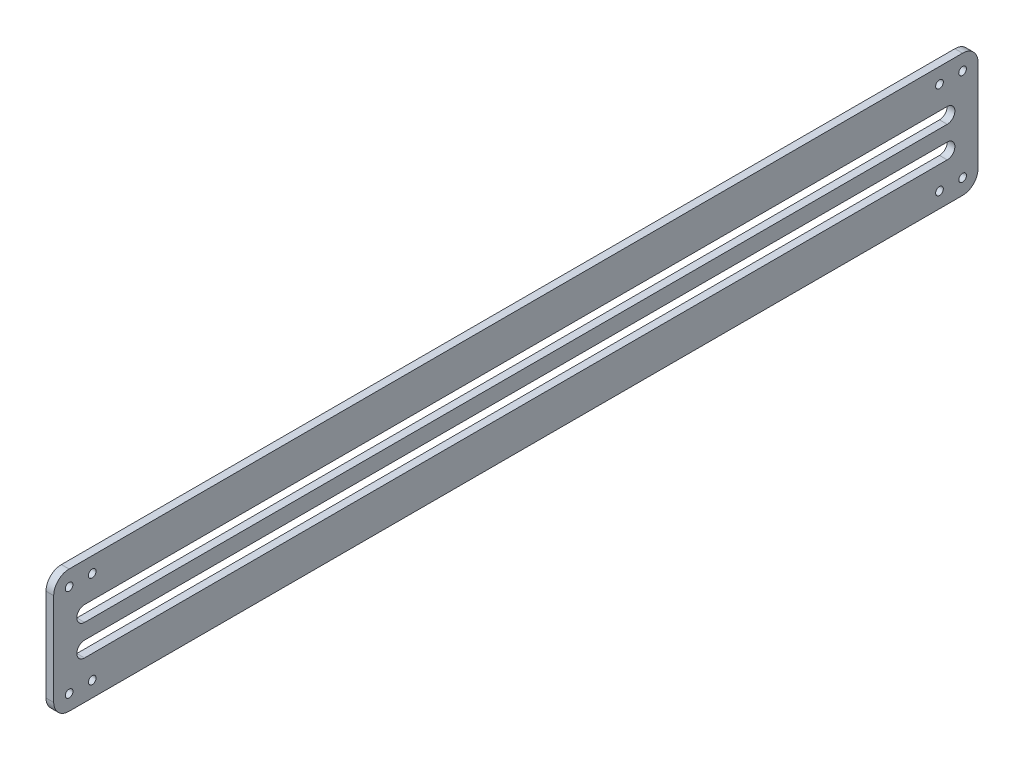
ISO-10303-21;
HEADER;
FILE_DESCRIPTION(('STEP AP214'),'2;1');
FILE_NAME('part.step','',(''),(''),'','','');
FILE_SCHEMA(('AUTOMOTIVE_DESIGN { 1 0 10303 214 1 1 1 1 }'));
ENDSEC;
DATA;
#1=APPLICATION_CONTEXT('core data for automotive mechanical design processes');
#2=APPLICATION_PROTOCOL_DEFINITION('international standard','automotive_design',2000,#1);
#3=PRODUCT_CONTEXT('',#1,'mechanical');
#4=PRODUCT('Part','Part','',(#3));
#5=PRODUCT_RELATED_PRODUCT_CATEGORY('part','',(#4));
#6=PRODUCT_DEFINITION_FORMATION('','',#4);
#7=PRODUCT_DEFINITION_CONTEXT('part definition',#1,'design');
#8=PRODUCT_DEFINITION('design','',#6,#7);
#9=PRODUCT_DEFINITION_SHAPE('','',#8);
#10=(LENGTH_UNIT() NAMED_UNIT(*) SI_UNIT(.MILLI.,.METRE.));
#11=(NAMED_UNIT(*) PLANE_ANGLE_UNIT() SI_UNIT($,.RADIAN.));
#12=(NAMED_UNIT(*) SI_UNIT($,.STERADIAN.) SOLID_ANGLE_UNIT());
#13=UNCERTAINTY_MEASURE_WITH_UNIT(LENGTH_MEASURE(1.E-05),#10,'distance_accuracy_value','');
#14=(GEOMETRIC_REPRESENTATION_CONTEXT(3) GLOBAL_UNCERTAINTY_ASSIGNED_CONTEXT((#13)) GLOBAL_UNIT_ASSIGNED_CONTEXT((#10,
#11,#12)) REPRESENTATION_CONTEXT('',''));
#15=CARTESIAN_POINT('',(0.,0.,0.));
#16=DIRECTION('',(0.,0.,1.));
#17=DIRECTION('',(1.,0.,0.));
#18=AXIS2_PLACEMENT_3D('',#15,#16,#17);
#19=CARTESIAN_POINT('',(1.5875,19.05,-184.15));
#20=DIRECTION('',(-1.,0.,0.));
#21=DIRECTION('',(0.,0.,1.));
#22=AXIS2_PLACEMENT_3D('',#19,#20,#21);
#23=CYLINDRICAL_SURFACE('',#22,6.35);
#24=CARTESIAN_POINT('',(-1.5875,19.05,-184.15));
#25=DIRECTION('',(1.,0.,0.));
#26=DIRECTION('',(0.,0.,1.));
#27=AXIS2_PLACEMENT_3D('',#24,#25,#26);
#28=CIRCLE('',#27,6.35);
#29=CARTESIAN_POINT('',(-1.5875,19.05,-190.5));
#30=VERTEX_POINT('',#29);
#31=CARTESIAN_POINT('',(-1.5875,25.4,-184.15));
#32=VERTEX_POINT('',#31);
#33=EDGE_CURVE('E207',#30,#32,#28,.T.);
#34=ORIENTED_EDGE('',*,*,#33,.T.);
#35=DIRECTION('',(-1.,0.,0.));
#36=VECTOR('',#35,1.);
#37=CARTESIAN_POINT('',(1.5875,25.4,-184.15));
#38=LINE('',#37,#36);
#39=CARTESIAN_POINT('',(1.5875,25.4,-184.15));
#40=VERTEX_POINT('',#39);
#41=EDGE_CURVE('E11',#40,#32,#38,.T.);
#42=ORIENTED_EDGE('',*,*,#41,.F.);
#43=CARTESIAN_POINT('',(1.5875,19.05,-184.15));
#44=DIRECTION('',(1.,0.,0.));
#45=DIRECTION('',(0.,0.,1.));
#46=AXIS2_PLACEMENT_3D('',#43,#44,#45);
#47=CIRCLE('',#46,6.35);
#48=CARTESIAN_POINT('',(1.5875,19.05,-190.5));
#49=VERTEX_POINT('',#48);
#50=EDGE_CURVE('E256',#49,#40,#47,.T.);
#51=ORIENTED_EDGE('',*,*,#50,.F.);
#52=DIRECTION('',(-1.,0.,0.));
#53=VECTOR('',#52,1.);
#54=CARTESIAN_POINT('',(1.5875,19.05,-190.5));
#55=LINE('',#54,#53);
#56=EDGE_CURVE('E282',#49,#30,#55,.T.);
#57=ORIENTED_EDGE('',*,*,#56,.T.);
#58=EDGE_LOOP('',(#34,#42,#51,#57));
#59=FACE_BOUND('',#58,.T.);
#60=ADVANCED_FACE('F45',(#59),#23,.T.);
#61=CARTESIAN_POINT('',(1.5875,25.4,184.15));
#62=DIRECTION('',(0.,-1.,0.));
#63=DIRECTION('',(0.,0.,-1.));
#64=AXIS2_PLACEMENT_3D('',#61,#62,#63);
#65=PLANE('',#64);
#66=DIRECTION('',(0.,0.,1.));
#67=VECTOR('',#66,1.);
#68=CARTESIAN_POINT('',(-1.5875,25.4,184.15));
#69=LINE('',#68,#67);
#70=CARTESIAN_POINT('',(-1.5875,25.4,184.15));
#71=VERTEX_POINT('',#70);
#72=EDGE_CURVE('E286',#32,#71,#69,.T.);
#73=ORIENTED_EDGE('',*,*,#72,.T.);
#74=DIRECTION('',(-1.,0.,0.));
#75=VECTOR('',#74,1.);
#76=CARTESIAN_POINT('',(1.5875,25.4,184.15));
#77=LINE('',#76,#75);
#78=CARTESIAN_POINT('',(1.5875,25.4,184.15));
#79=VERTEX_POINT('',#78);
#80=EDGE_CURVE('E53',#79,#71,#77,.T.);
#81=ORIENTED_EDGE('',*,*,#80,.F.);
#82=DIRECTION('',(0.,0.,1.));
#83=VECTOR('',#82,1.);
#84=CARTESIAN_POINT('',(1.5875,25.4,184.15));
#85=LINE('',#84,#83);
#86=EDGE_CURVE('E260',#40,#79,#85,.T.);
#87=ORIENTED_EDGE('',*,*,#86,.F.);
#88=ORIENTED_EDGE('',*,*,#41,.T.);
#89=EDGE_LOOP('',(#73,#81,#87,#88));
#90=FACE_BOUND('',#89,.T.);
#91=ADVANCED_FACE('F356',(#90),#65,.F.);
#92=CARTESIAN_POINT('',(1.5875,19.05,184.15));
#93=DIRECTION('',(-1.,0.,0.));
#94=DIRECTION('',(0.,0.,1.));
#95=AXIS2_PLACEMENT_3D('',#92,#93,#94);
#96=CYLINDRICAL_SURFACE('',#95,6.35);
#97=CARTESIAN_POINT('',(-1.5875,19.05,184.15));
#98=DIRECTION('',(1.,0.,0.));
#99=DIRECTION('',(0.,0.,1.));
#100=AXIS2_PLACEMENT_3D('',#97,#98,#99);
#101=CIRCLE('',#100,6.35);
#102=CARTESIAN_POINT('',(-1.5875,19.05,190.5));
#103=VERTEX_POINT('',#102);
#104=EDGE_CURVE('E289',#71,#103,#101,.T.);
#105=ORIENTED_EDGE('',*,*,#104,.T.);
#106=DIRECTION('',(-1.,0.,0.));
#107=VECTOR('',#106,1.);
#108=CARTESIAN_POINT('',(1.5875,19.05,190.5));
#109=LINE('',#108,#107);
#110=CARTESIAN_POINT('',(1.5875,19.05,190.5));
#111=VERTEX_POINT('',#110);
#112=EDGE_CURVE('E325',#111,#103,#109,.T.);
#113=ORIENTED_EDGE('',*,*,#112,.F.);
#114=CARTESIAN_POINT('',(1.5875,19.05,184.15));
#115=DIRECTION('',(1.,0.,0.));
#116=DIRECTION('',(0.,0.,1.));
#117=AXIS2_PLACEMENT_3D('',#114,#115,#116);
#118=CIRCLE('',#117,6.35);
#119=EDGE_CURVE('E264',#79,#111,#118,.T.);
#120=ORIENTED_EDGE('',*,*,#119,.F.);
#121=ORIENTED_EDGE('',*,*,#80,.T.);
#122=EDGE_LOOP('',(#105,#113,#120,#121));
#123=FACE_BOUND('',#122,.T.);
#124=ADVANCED_FACE('F334',(#123),#96,.T.);
#125=CARTESIAN_POINT('',(1.5875,-19.05,190.5));
#126=DIRECTION('',(0.,0.,-1.));
#127=DIRECTION('',(-1.,0.,0.));
#128=AXIS2_PLACEMENT_3D('',#125,#126,#127);
#129=PLANE('',#128);
#130=DIRECTION('',(0.,-1.,0.));
#131=VECTOR('',#130,1.);
#132=CARTESIAN_POINT('',(-1.5875,-19.05,190.5));
#133=LINE('',#132,#131);
#134=CARTESIAN_POINT('',(-1.5875,-19.05,190.5));
#135=VERTEX_POINT('',#134);
#136=EDGE_CURVE('E292',#103,#135,#133,.T.);
#137=ORIENTED_EDGE('',*,*,#136,.T.);
#138=DIRECTION('',(-1.,0.,0.));
#139=VECTOR('',#138,1.);
#140=CARTESIAN_POINT('',(1.5875,-19.05,190.5));
#141=LINE('',#140,#139);
#142=CARTESIAN_POINT('',(1.5875,-19.05,190.5));
#143=VERTEX_POINT('',#142);
#144=EDGE_CURVE('E321',#143,#135,#141,.T.);
#145=ORIENTED_EDGE('',*,*,#144,.F.);
#146=DIRECTION('',(0.,-1.,0.));
#147=VECTOR('',#146,1.);
#148=CARTESIAN_POINT('',(1.5875,-19.05,190.5));
#149=LINE('',#148,#147);
#150=EDGE_CURVE('E267',#111,#143,#149,.T.);
#151=ORIENTED_EDGE('',*,*,#150,.F.);
#152=ORIENTED_EDGE('',*,*,#112,.T.);
#153=EDGE_LOOP('',(#137,#145,#151,#152));
#154=FACE_BOUND('',#153,.T.);
#155=ADVANCED_FACE('F344',(#154),#129,.F.);
#156=CARTESIAN_POINT('',(1.5875,-19.05,184.15));
#157=DIRECTION('',(-1.,0.,0.));
#158=DIRECTION('',(0.,0.,1.));
#159=AXIS2_PLACEMENT_3D('',#156,#157,#158);
#160=CYLINDRICAL_SURFACE('',#159,6.35);
#161=CARTESIAN_POINT('',(-1.5875,-19.05,184.15));
#162=DIRECTION('',(1.,0.,0.));
#163=DIRECTION('',(0.,0.,1.));
#164=AXIS2_PLACEMENT_3D('',#161,#162,#163);
#165=CIRCLE('',#164,6.35);
#166=CARTESIAN_POINT('',(-1.5875,-25.4,184.15));
#167=VERTEX_POINT('',#166);
#168=EDGE_CURVE('E295',#135,#167,#165,.T.);
#169=ORIENTED_EDGE('',*,*,#168,.T.);
#170=DIRECTION('',(-1.,0.,0.));
#171=VECTOR('',#170,1.);
#172=CARTESIAN_POINT('',(1.5875,-25.4,184.15));
#173=LINE('',#172,#171);
#174=CARTESIAN_POINT('',(1.5875,-25.4,184.15));
#175=VERTEX_POINT('',#174);
#176=EDGE_CURVE('E317',#175,#167,#173,.T.);
#177=ORIENTED_EDGE('',*,*,#176,.F.);
#178=CARTESIAN_POINT('',(1.5875,-19.05,184.15));
#179=DIRECTION('',(1.,0.,0.));
#180=DIRECTION('',(0.,0.,1.));
#181=AXIS2_PLACEMENT_3D('',#178,#179,#180);
#182=CIRCLE('',#181,6.35);
#183=EDGE_CURVE('E270',#143,#175,#182,.T.);
#184=ORIENTED_EDGE('',*,*,#183,.F.);
#185=ORIENTED_EDGE('',*,*,#144,.T.);
#186=EDGE_LOOP('',(#169,#177,#184,#185));
#187=FACE_BOUND('',#186,.T.);
#188=ADVANCED_FACE('F348',(#187),#160,.T.);
#189=CARTESIAN_POINT('',(1.5875,-25.4,184.15));
#190=DIRECTION('',(0.,1.,0.));
#191=DIRECTION('',(0.,0.,1.));
#192=AXIS2_PLACEMENT_3D('',#189,#190,#191);
#193=PLANE('',#192);
#194=DIRECTION('',(0.,0.,-1.));
#195=VECTOR('',#194,1.);
#196=CARTESIAN_POINT('',(-1.5875,-25.4,184.15));
#197=LINE('',#196,#195);
#198=CARTESIAN_POINT('',(-1.5875,-25.4,-184.15));
#199=VERTEX_POINT('',#198);
#200=EDGE_CURVE('E298',#167,#199,#197,.T.);
#201=ORIENTED_EDGE('',*,*,#200,.T.);
#202=DIRECTION('',(-1.,0.,0.));
#203=VECTOR('',#202,1.);
#204=CARTESIAN_POINT('',(1.5875,-25.4,-184.15));
#205=LINE('',#204,#203);
#206=CARTESIAN_POINT('',(1.5875,-25.4,-184.15));
#207=VERTEX_POINT('',#206);
#208=EDGE_CURVE('E313',#207,#199,#205,.T.);
#209=ORIENTED_EDGE('',*,*,#208,.F.);
#210=DIRECTION('',(0.,0.,-1.));
#211=VECTOR('',#210,1.);
#212=CARTESIAN_POINT('',(1.5875,-25.4,184.15));
#213=LINE('',#212,#211);
#214=EDGE_CURVE('E273',#175,#207,#213,.T.);
#215=ORIENTED_EDGE('',*,*,#214,.F.);
#216=ORIENTED_EDGE('',*,*,#176,.T.);
#217=EDGE_LOOP('',(#201,#209,#215,#216));
#218=FACE_BOUND('',#217,.T.);
#219=ADVANCED_FACE('F369',(#218),#193,.F.);
#220=CARTESIAN_POINT('',(1.5875,-19.05,-184.15));
#221=DIRECTION('',(-1.,0.,0.));
#222=DIRECTION('',(0.,0.,1.));
#223=AXIS2_PLACEMENT_3D('',#220,#221,#222);
#224=CYLINDRICAL_SURFACE('',#223,6.35);
#225=CARTESIAN_POINT('',(-1.5875,-19.05,-184.15));
#226=DIRECTION('',(1.,0.,0.));
#227=DIRECTION('',(0.,0.,1.));
#228=AXIS2_PLACEMENT_3D('',#225,#226,#227);
#229=CIRCLE('',#228,6.35);
#230=CARTESIAN_POINT('',(-1.5875,-19.05,-190.5));
#231=VERTEX_POINT('',#230);
#232=EDGE_CURVE('E301',#199,#231,#229,.T.);
#233=ORIENTED_EDGE('',*,*,#232,.T.);
#234=DIRECTION('',(-1.,0.,0.));
#235=VECTOR('',#234,1.);
#236=CARTESIAN_POINT('',(1.5875,-19.05,-190.5));
#237=LINE('',#236,#235);
#238=CARTESIAN_POINT('',(1.5875,-19.05,-190.5));
#239=VERTEX_POINT('',#238);
#240=EDGE_CURVE('E309',#239,#231,#237,.T.);
#241=ORIENTED_EDGE('',*,*,#240,.F.);
#242=CARTESIAN_POINT('',(1.5875,-19.05,-184.15));
#243=DIRECTION('',(1.,0.,0.));
#244=DIRECTION('',(0.,0.,1.));
#245=AXIS2_PLACEMENT_3D('',#242,#243,#244);
#246=CIRCLE('',#245,6.35);
#247=EDGE_CURVE('E276',#207,#239,#246,.T.);
#248=ORIENTED_EDGE('',*,*,#247,.F.);
#249=ORIENTED_EDGE('',*,*,#208,.T.);
#250=EDGE_LOOP('',(#233,#241,#248,#249));
#251=FACE_BOUND('',#250,.T.);
#252=ADVANCED_FACE('F367',(#251),#224,.T.);
#253=CARTESIAN_POINT('',(1.5875,-19.05,-190.5));
#254=DIRECTION('',(0.,0.,1.));
#255=DIRECTION('',(1.,0.,0.));
#256=AXIS2_PLACEMENT_3D('',#253,#254,#255);
#257=PLANE('',#256);
#258=DIRECTION('',(0.,1.,0.));
#259=VECTOR('',#258,1.);
#260=CARTESIAN_POINT('',(-1.5875,-19.05,-190.5));
#261=LINE('',#260,#259);
#262=EDGE_CURVE('E261',#231,#30,#261,.T.);
#263=ORIENTED_EDGE('',*,*,#262,.T.);
#264=ORIENTED_EDGE('',*,*,#56,.F.);
#265=DIRECTION('',(0.,1.,0.));
#266=VECTOR('',#265,1.);
#267=CARTESIAN_POINT('',(1.5875,-19.05,-190.5));
#268=LINE('',#267,#266);
#269=EDGE_CURVE('E279',#239,#49,#268,.T.);
#270=ORIENTED_EDGE('',*,*,#269,.F.);
#271=ORIENTED_EDGE('',*,*,#240,.T.);
#272=EDGE_LOOP('',(#263,#264,#270,#271));
#273=FACE_BOUND('',#272,.T.);
#274=ADVANCED_FACE('F362',(#273),#257,.F.);
#275=CARTESIAN_POINT('',(1.5875,19.05,-184.15));
#276=DIRECTION('',(-1.,0.,0.));
#277=DIRECTION('',(0.,0.,1.));
#278=AXIS2_PLACEMENT_3D('',#275,#276,#277);
#279=PLANE('',#278);
#280=CARTESIAN_POINT('',(1.5875,19.05,-174.625));
#281=DIRECTION('',(1.,0.,0.));
#282=DIRECTION('',(0.,0.,1.));
#283=AXIS2_PLACEMENT_3D('',#280,#281,#282);
#284=CIRCLE('',#283,1.58749999999999);
#285=CARTESIAN_POINT('',(1.5875,19.05,-173.0375));
#286=VERTEX_POINT('',#285);
#287=EDGE_CURVE('E598',#286,#286,#284,.T.);
#288=ORIENTED_EDGE('',*,*,#287,.F.);
#289=EDGE_LOOP('',(#288));
#290=FACE_BOUND('',#289,.T.);
#291=CARTESIAN_POINT('',(1.5875,-19.0500000000001,184.15));
#292=DIRECTION('',(1.,0.,0.));
#293=DIRECTION('',(0.,0.,1.));
#294=AXIS2_PLACEMENT_3D('',#291,#292,#293);
#295=CIRCLE('',#294,1.58749999999999);
#296=CARTESIAN_POINT('',(1.5875,-19.0500000000001,185.7375));
#297=VERTEX_POINT('',#296);
#298=EDGE_CURVE('E605',#297,#297,#295,.T.);
#299=ORIENTED_EDGE('',*,*,#298,.F.);
#300=EDGE_LOOP('',(#299));
#301=FACE_BOUND('',#300,.T.);
#302=CARTESIAN_POINT('',(1.5875,-19.05,174.625));
#303=DIRECTION('',(1.,0.,0.));
#304=DIRECTION('',(0.,0.,1.));
#305=AXIS2_PLACEMENT_3D('',#302,#303,#304);
#306=CIRCLE('',#305,1.58749999999999);
#307=CARTESIAN_POINT('',(1.5875,-19.05,176.2125));
#308=VERTEX_POINT('',#307);
#309=EDGE_CURVE('E619',#308,#308,#306,.T.);
#310=ORIENTED_EDGE('',*,*,#309,.F.);
#311=EDGE_LOOP('',(#310));
#312=FACE_BOUND('',#311,.T.);
#313=CARTESIAN_POINT('',(1.5875,19.05,174.625));
#314=DIRECTION('',(1.,0.,0.));
#315=DIRECTION('',(0.,0.,-1.));
#316=AXIS2_PLACEMENT_3D('',#313,#314,#315);
#317=CIRCLE('',#316,1.58749999999999);
#318=CARTESIAN_POINT('',(1.5875,19.05,173.0375));
#319=VERTEX_POINT('',#318);
#320=EDGE_CURVE('E611',#319,#319,#317,.T.);
#321=ORIENTED_EDGE('',*,*,#320,.F.);
#322=EDGE_LOOP('',(#321));
#323=FACE_BOUND('',#322,.T.);
#324=CARTESIAN_POINT('',(1.5875,19.05,-184.15));
#325=DIRECTION('',(1.,0.,0.));
#326=DIRECTION('',(0.,0.,1.));
#327=AXIS2_PLACEMENT_3D('',#324,#325,#326);
#328=CIRCLE('',#327,1.58749999999999);
#329=CARTESIAN_POINT('',(1.5875,19.05,-182.5625));
#330=VERTEX_POINT('',#329);
#331=EDGE_CURVE('E607',#330,#330,#328,.T.);
#332=ORIENTED_EDGE('',*,*,#331,.F.);
#333=EDGE_LOOP('',(#332));
#334=FACE_BOUND('',#333,.T.);
#335=CARTESIAN_POINT('',(1.5875,-19.0500000000001,-184.15));
#336=DIRECTION('',(1.,0.,0.));
#337=DIRECTION('',(0.,0.,-1.));
#338=AXIS2_PLACEMENT_3D('',#335,#336,#337);
#339=CIRCLE('',#338,1.58749999999999);
#340=CARTESIAN_POINT('',(1.5875,-19.0500000000001,-185.7375));
#341=VERTEX_POINT('',#340);
#342=EDGE_CURVE('E663',#341,#341,#339,.T.);
#343=ORIENTED_EDGE('',*,*,#342,.F.);
#344=EDGE_LOOP('',(#343));
#345=FACE_BOUND('',#344,.T.);
#346=CARTESIAN_POINT('',(1.5875,-19.05,-174.625));
#347=DIRECTION('',(1.,0.,0.));
#348=DIRECTION('',(0.,0.,-1.));
#349=AXIS2_PLACEMENT_3D('',#346,#347,#348);
#350=CIRCLE('',#349,1.58749999999999);
#351=CARTESIAN_POINT('',(1.5875,-19.05,-176.2125));
#352=VERTEX_POINT('',#351);
#353=EDGE_CURVE('E655',#352,#352,#350,.T.);
#354=ORIENTED_EDGE('',*,*,#353,.F.);
#355=EDGE_LOOP('',(#354));
#356=FACE_BOUND('',#355,.T.);
#357=CARTESIAN_POINT('',(1.5875,19.05,184.15));
#358=DIRECTION('',(1.,0.,0.));
#359=DIRECTION('',(0.,0.,-1.));
#360=AXIS2_PLACEMENT_3D('',#357,#358,#359);
#361=CIRCLE('',#360,1.58749999999999);
#362=CARTESIAN_POINT('',(1.5875,19.05,182.5625));
#363=VERTEX_POINT('',#362);
#364=EDGE_CURVE('E189',#363,#363,#361,.T.);
#365=ORIENTED_EDGE('',*,*,#364,.F.);
#366=EDGE_LOOP('',(#365));
#367=FACE_BOUND('',#366,.T.);
#368=DIRECTION('',(0.,0.,-1.));
#369=VECTOR('',#368,1.);
#370=CARTESIAN_POINT('',(1.5875,3.175,177.8));
#371=LINE('',#370,#369);
#372=CARTESIAN_POINT('',(1.5875,3.175,177.8));
#373=VERTEX_POINT('',#372);
#374=CARTESIAN_POINT('',(1.5875,3.175,-177.8));
#375=VERTEX_POINT('',#374);
#376=EDGE_CURVE('E198',#373,#375,#371,.T.);
#377=ORIENTED_EDGE('',*,*,#376,.F.);
#378=CARTESIAN_POINT('',(1.5875,6.35000000000001,177.8));
#379=DIRECTION('',(1.,0.,0.));
#380=DIRECTION('',(0.,0.,-1.));
#381=AXIS2_PLACEMENT_3D('',#378,#379,#380);
#382=CIRCLE('',#381,3.17500000000001);
#383=CARTESIAN_POINT('',(1.5875,9.52500000000002,177.8));
#384=VERTEX_POINT('',#383);
#385=EDGE_CURVE('E60',#384,#373,#382,.T.);
#386=ORIENTED_EDGE('',*,*,#385,.F.);
#387=DIRECTION('',(0.,0.,1.));
#388=VECTOR('',#387,1.);
#389=CARTESIAN_POINT('',(1.5875,9.52500000000002,177.8));
#390=LINE('',#389,#388);
#391=CARTESIAN_POINT('',(1.5875,9.52500000000002,-177.8));
#392=VERTEX_POINT('',#391);
#393=EDGE_CURVE('E182',#392,#384,#390,.T.);
#394=ORIENTED_EDGE('',*,*,#393,.F.);
#395=CARTESIAN_POINT('',(1.5875,6.35000000000001,-177.8));
#396=DIRECTION('',(1.,0.,0.));
#397=DIRECTION('',(0.,0.,-1.));
#398=AXIS2_PLACEMENT_3D('',#395,#396,#397);
#399=CIRCLE('',#398,3.17500000000001);
#400=EDGE_CURVE('E186',#375,#392,#399,.T.);
#401=ORIENTED_EDGE('',*,*,#400,.F.);
#402=EDGE_LOOP('',(#377,#386,#394,#401));
#403=FACE_BOUND('',#402,.T.);
#404=DIRECTION('',(0.,0.,-1.));
#405=VECTOR('',#404,1.);
#406=CARTESIAN_POINT('',(1.5875,-9.52500000000002,177.8));
#407=LINE('',#406,#405);
#408=CARTESIAN_POINT('',(1.5875,-9.52500000000002,177.8));
#409=VERTEX_POINT('',#408);
#410=CARTESIAN_POINT('',(1.5875,-9.52500000000002,-177.8));
#411=VERTEX_POINT('',#410);
#412=EDGE_CURVE('E236',#409,#411,#407,.T.);
#413=ORIENTED_EDGE('',*,*,#412,.F.);
#414=CARTESIAN_POINT('',(1.5875,-6.35000000000001,177.8));
#415=DIRECTION('',(1.,0.,0.));
#416=DIRECTION('',(0.,0.,1.));
#417=AXIS2_PLACEMENT_3D('',#414,#415,#416);
#418=CIRCLE('',#417,3.17500000000001);
#419=CARTESIAN_POINT('',(1.5875,-3.175,177.8));
#420=VERTEX_POINT('',#419);
#421=EDGE_CURVE('E68',#420,#409,#418,.T.);
#422=ORIENTED_EDGE('',*,*,#421,.F.);
#423=DIRECTION('',(0.,0.,1.));
#424=VECTOR('',#423,1.);
#425=CARTESIAN_POINT('',(1.5875,-3.175,177.8));
#426=LINE('',#425,#424);
#427=CARTESIAN_POINT('',(1.5875,-3.175,-177.8));
#428=VERTEX_POINT('',#427);
#429=EDGE_CURVE('E227',#428,#420,#426,.T.);
#430=ORIENTED_EDGE('',*,*,#429,.F.);
#431=CARTESIAN_POINT('',(1.5875,-6.35000000000001,-177.8));
#432=DIRECTION('',(1.,0.,0.));
#433=DIRECTION('',(0.,0.,1.));
#434=AXIS2_PLACEMENT_3D('',#431,#432,#433);
#435=CIRCLE('',#434,3.17500000000001);
#436=EDGE_CURVE('E231',#411,#428,#435,.T.);
#437=ORIENTED_EDGE('',*,*,#436,.F.);
#438=EDGE_LOOP('',(#413,#422,#430,#437));
#439=FACE_BOUND('',#438,.T.);
#440=ORIENTED_EDGE('',*,*,#50,.T.);
#441=ORIENTED_EDGE('',*,*,#86,.T.);
#442=ORIENTED_EDGE('',*,*,#119,.T.);
#443=ORIENTED_EDGE('',*,*,#150,.T.);
#444=ORIENTED_EDGE('',*,*,#183,.T.);
#445=ORIENTED_EDGE('',*,*,#214,.T.);
#446=ORIENTED_EDGE('',*,*,#247,.T.);
#447=ORIENTED_EDGE('',*,*,#269,.T.);
#448=EDGE_LOOP('',(#440,#441,#442,#443,#444,#445,#446,#447));
#449=FACE_BOUND('',#448,.T.);
#450=ADVANCED_FACE('F352',(#290,#301,#312,#323,#334,#345,#356,#367,#403,#439,#449),#279,.F.);
#451=CARTESIAN_POINT('',(-1.5875,19.05,-184.15));
#452=DIRECTION('',(-1.,0.,0.));
#453=DIRECTION('',(0.,0.,1.));
#454=AXIS2_PLACEMENT_3D('',#451,#452,#453);
#455=PLANE('',#454);
#456=CARTESIAN_POINT('',(-1.5875,19.05,-174.625));
#457=DIRECTION('',(1.,0.,0.));
#458=DIRECTION('',(0.,0.,1.));
#459=AXIS2_PLACEMENT_3D('',#456,#457,#458);
#460=CIRCLE('',#459,1.58749999999999);
#461=CARTESIAN_POINT('',(-1.5875,19.05,-173.0375));
#462=VERTEX_POINT('',#461);
#463=EDGE_CURVE('E595',#462,#462,#460,.T.);
#464=ORIENTED_EDGE('',*,*,#463,.T.);
#465=EDGE_LOOP('',(#464));
#466=FACE_BOUND('',#465,.T.);
#467=CARTESIAN_POINT('',(-1.5875,-19.0500000000001,184.15));
#468=DIRECTION('',(1.,0.,0.));
#469=DIRECTION('',(0.,0.,1.));
#470=AXIS2_PLACEMENT_3D('',#467,#468,#469);
#471=CIRCLE('',#470,1.58749999999999);
#472=CARTESIAN_POINT('',(-1.5875,-19.0500000000001,185.7375));
#473=VERTEX_POINT('',#472);
#474=EDGE_CURVE('E600',#473,#473,#471,.T.);
#475=ORIENTED_EDGE('',*,*,#474,.T.);
#476=EDGE_LOOP('',(#475));
#477=FACE_BOUND('',#476,.T.);
#478=CARTESIAN_POINT('',(-1.5875,-19.05,174.625));
#479=DIRECTION('',(1.,0.,0.));
#480=DIRECTION('',(0.,0.,1.));
#481=AXIS2_PLACEMENT_3D('',#478,#479,#480);
#482=CIRCLE('',#481,1.58749999999999);
#483=CARTESIAN_POINT('',(-1.5875,-19.05,176.2125));
#484=VERTEX_POINT('',#483);
#485=EDGE_CURVE('E623',#484,#484,#482,.T.);
#486=ORIENTED_EDGE('',*,*,#485,.T.);
#487=EDGE_LOOP('',(#486));
#488=FACE_BOUND('',#487,.T.);
#489=CARTESIAN_POINT('',(-1.5875,19.05,174.625));
#490=DIRECTION('',(1.,0.,0.));
#491=DIRECTION('',(0.,0.,-1.));
#492=AXIS2_PLACEMENT_3D('',#489,#490,#491);
#493=CIRCLE('',#492,1.58749999999999);
#494=CARTESIAN_POINT('',(-1.5875,19.05,173.0375));
#495=VERTEX_POINT('',#494);
#496=EDGE_CURVE('E615',#495,#495,#493,.T.);
#497=ORIENTED_EDGE('',*,*,#496,.T.);
#498=EDGE_LOOP('',(#497));
#499=FACE_BOUND('',#498,.T.);
#500=CARTESIAN_POINT('',(-1.5875,19.05,-184.15));
#501=DIRECTION('',(1.,0.,0.));
#502=DIRECTION('',(0.,0.,1.));
#503=AXIS2_PLACEMENT_3D('',#500,#501,#502);
#504=CIRCLE('',#503,1.58749999999999);
#505=CARTESIAN_POINT('',(-1.5875,19.05,-182.5625));
#506=VERTEX_POINT('',#505);
#507=EDGE_CURVE('E667',#506,#506,#504,.T.);
#508=ORIENTED_EDGE('',*,*,#507,.T.);
#509=EDGE_LOOP('',(#508));
#510=FACE_BOUND('',#509,.T.);
#511=CARTESIAN_POINT('',(-1.5875,-19.0500000000001,-184.15));
#512=DIRECTION('',(1.,0.,0.));
#513=DIRECTION('',(0.,0.,-1.));
#514=AXIS2_PLACEMENT_3D('',#511,#512,#513);
#515=CIRCLE('',#514,1.58749999999999);
#516=CARTESIAN_POINT('',(-1.5875,-19.0500000000001,-185.7375));
#517=VERTEX_POINT('',#516);
#518=EDGE_CURVE('E659',#517,#517,#515,.T.);
#519=ORIENTED_EDGE('',*,*,#518,.T.);
#520=EDGE_LOOP('',(#519));
#521=FACE_BOUND('',#520,.T.);
#522=CARTESIAN_POINT('',(-1.5875,-19.05,-174.625));
#523=DIRECTION('',(1.,0.,0.));
#524=DIRECTION('',(0.,0.,-1.));
#525=AXIS2_PLACEMENT_3D('',#522,#523,#524);
#526=CIRCLE('',#525,1.58749999999999);
#527=CARTESIAN_POINT('',(-1.5875,-19.05,-176.2125));
#528=VERTEX_POINT('',#527);
#529=EDGE_CURVE('E651',#528,#528,#526,.T.);
#530=ORIENTED_EDGE('',*,*,#529,.T.);
#531=EDGE_LOOP('',(#530));
#532=FACE_BOUND('',#531,.T.);
#533=CARTESIAN_POINT('',(-1.5875,19.05,184.15));
#534=DIRECTION('',(1.,0.,0.));
#535=DIRECTION('',(0.,0.,-1.));
#536=AXIS2_PLACEMENT_3D('',#533,#534,#535);
#537=CIRCLE('',#536,1.58749999999999);
#538=CARTESIAN_POINT('',(-1.5875,19.05,182.5625));
#539=VERTEX_POINT('',#538);
#540=EDGE_CURVE('E226',#539,#539,#537,.T.);
#541=ORIENTED_EDGE('',*,*,#540,.T.);
#542=EDGE_LOOP('',(#541));
#543=FACE_BOUND('',#542,.T.);
#544=CARTESIAN_POINT('',(-1.5875,6.35000000000001,177.8));
#545=DIRECTION('',(1.,0.,0.));
#546=DIRECTION('',(0.,0.,-1.));
#547=AXIS2_PLACEMENT_3D('',#544,#545,#546);
#548=CIRCLE('',#547,3.17500000000001);
#549=CARTESIAN_POINT('',(-1.5875,9.52500000000002,177.8));
#550=VERTEX_POINT('',#549);
#551=CARTESIAN_POINT('',(-1.5875,3.175,177.8));
#552=VERTEX_POINT('',#551);
#553=EDGE_CURVE('E160',#550,#552,#548,.T.);
#554=ORIENTED_EDGE('',*,*,#553,.T.);
#555=DIRECTION('',(0.,0.,-1.));
#556=VECTOR('',#555,1.);
#557=CARTESIAN_POINT('',(-1.5875,3.175,177.8));
#558=LINE('',#557,#556);
#559=CARTESIAN_POINT('',(-1.5875,3.175,-177.8));
#560=VERTEX_POINT('',#559);
#561=EDGE_CURVE('E171',#552,#560,#558,.T.);
#562=ORIENTED_EDGE('',*,*,#561,.T.);
#563=CARTESIAN_POINT('',(-1.5875,6.35000000000001,-177.8));
#564=DIRECTION('',(1.,0.,0.));
#565=DIRECTION('',(0.,0.,-1.));
#566=AXIS2_PLACEMENT_3D('',#563,#564,#565);
#567=CIRCLE('',#566,3.17500000000001);
#568=CARTESIAN_POINT('',(-1.5875,9.52500000000002,-177.8));
#569=VERTEX_POINT('',#568);
#570=EDGE_CURVE('E176',#560,#569,#567,.T.);
#571=ORIENTED_EDGE('',*,*,#570,.T.);
#572=DIRECTION('',(0.,0.,1.));
#573=VECTOR('',#572,1.);
#574=CARTESIAN_POINT('',(-1.5875,9.52500000000002,177.8));
#575=LINE('',#574,#573);
#576=EDGE_CURVE('E167',#569,#550,#575,.T.);
#577=ORIENTED_EDGE('',*,*,#576,.T.);
#578=EDGE_LOOP('',(#554,#562,#571,#577));
#579=FACE_BOUND('',#578,.T.);
#580=CARTESIAN_POINT('',(-1.5875,-6.35000000000001,177.8));
#581=DIRECTION('',(1.,0.,0.));
#582=DIRECTION('',(0.,0.,1.));
#583=AXIS2_PLACEMENT_3D('',#580,#581,#582);
#584=CIRCLE('',#583,3.17500000000001);
#585=CARTESIAN_POINT('',(-1.5875,-3.175,177.8));
#586=VERTEX_POINT('',#585);
#587=CARTESIAN_POINT('',(-1.5875,-9.52500000000002,177.8));
#588=VERTEX_POINT('',#587);
#589=EDGE_CURVE('E232',#586,#588,#584,.T.);
#590=ORIENTED_EDGE('',*,*,#589,.T.);
#591=DIRECTION('',(0.,0.,-1.));
#592=VECTOR('',#591,1.);
#593=CARTESIAN_POINT('',(-1.5875,-9.52500000000002,177.8));
#594=LINE('',#593,#592);
#595=CARTESIAN_POINT('',(-1.5875,-9.52500000000002,-177.8));
#596=VERTEX_POINT('',#595);
#597=EDGE_CURVE('E249',#588,#596,#594,.T.);
#598=ORIENTED_EDGE('',*,*,#597,.T.);
#599=CARTESIAN_POINT('',(-1.5875,-6.35000000000001,-177.8));
#600=DIRECTION('',(1.,0.,0.));
#601=DIRECTION('',(0.,0.,1.));
#602=AXIS2_PLACEMENT_3D('',#599,#600,#601);
#603=CIRCLE('',#602,3.17500000000001);
#604=CARTESIAN_POINT('',(-1.5875,-3.175,-177.8));
#605=VERTEX_POINT('',#604);
#606=EDGE_CURVE('E245',#596,#605,#603,.T.);
#607=ORIENTED_EDGE('',*,*,#606,.T.);
#608=DIRECTION('',(0.,0.,1.));
#609=VECTOR('',#608,1.);
#610=CARTESIAN_POINT('',(-1.5875,-3.175,177.8));
#611=LINE('',#610,#609);
#612=EDGE_CURVE('E216',#605,#586,#611,.T.);
#613=ORIENTED_EDGE('',*,*,#612,.T.);
#614=EDGE_LOOP('',(#590,#598,#607,#613));
#615=FACE_BOUND('',#614,.T.);
#616=ORIENTED_EDGE('',*,*,#33,.F.);
#617=ORIENTED_EDGE('',*,*,#262,.F.);
#618=ORIENTED_EDGE('',*,*,#232,.F.);
#619=ORIENTED_EDGE('',*,*,#200,.F.);
#620=ORIENTED_EDGE('',*,*,#168,.F.);
#621=ORIENTED_EDGE('',*,*,#136,.F.);
#622=ORIENTED_EDGE('',*,*,#104,.F.);
#623=ORIENTED_EDGE('',*,*,#72,.F.);
#624=EDGE_LOOP('',(#616,#617,#618,#619,#620,#621,#622,#623));
#625=FACE_BOUND('',#624,.T.);
#626=ADVANCED_FACE('F178',(#466,#477,#488,#499,#510,#521,#532,#543,#579,#615,#625),#455,.T.);
#627=CARTESIAN_POINT('',(-1.5875,-6.35000000000001,177.8));
#628=DIRECTION('',(1.,0.,0.));
#629=DIRECTION('',(0.,0.,-1.));
#630=AXIS2_PLACEMENT_3D('',#627,#628,#629);
#631=CYLINDRICAL_SURFACE('',#630,3.17500000000001);
#632=ORIENTED_EDGE('',*,*,#421,.T.);
#633=DIRECTION('',(1.,0.,0.));
#634=VECTOR('',#633,1.);
#635=CARTESIAN_POINT('',(-1.5875,-9.52500000000002,177.8));
#636=LINE('',#635,#634);
#637=EDGE_CURVE('E213',#588,#409,#636,.T.);
#638=ORIENTED_EDGE('',*,*,#637,.F.);
#639=ORIENTED_EDGE('',*,*,#589,.F.);
#640=DIRECTION('',(1.,0.,0.));
#641=VECTOR('',#640,1.);
#642=CARTESIAN_POINT('',(-1.5875,-3.175,177.8));
#643=LINE('',#642,#641);
#644=EDGE_CURVE('E223',#586,#420,#643,.T.);
#645=ORIENTED_EDGE('',*,*,#644,.T.);
#646=EDGE_LOOP('',(#632,#638,#639,#645));
#647=FACE_BOUND('',#646,.T.);
#648=ADVANCED_FACE('F436',(#647),#631,.F.);
#649=CARTESIAN_POINT('',(-1.5875,-3.175,177.8));
#650=DIRECTION('',(0.,1.,0.));
#651=DIRECTION('',(0.,0.,1.));
#652=AXIS2_PLACEMENT_3D('',#649,#650,#651);
#653=PLANE('',#652);
#654=ORIENTED_EDGE('',*,*,#429,.T.);
#655=ORIENTED_EDGE('',*,*,#644,.F.);
#656=ORIENTED_EDGE('',*,*,#612,.F.);
#657=DIRECTION('',(1.,0.,0.));
#658=VECTOR('',#657,1.);
#659=CARTESIAN_POINT('',(-1.5875,-3.175,-177.8));
#660=LINE('',#659,#658);
#661=EDGE_CURVE('E220',#605,#428,#660,.T.);
#662=ORIENTED_EDGE('',*,*,#661,.T.);
#663=EDGE_LOOP('',(#654,#655,#656,#662));
#664=FACE_BOUND('',#663,.T.);
#665=ADVANCED_FACE('F446',(#664),#653,.F.);
#666=CARTESIAN_POINT('',(-1.5875,-6.35000000000001,-177.8));
#667=DIRECTION('',(1.,0.,0.));
#668=DIRECTION('',(0.,0.,-1.));
#669=AXIS2_PLACEMENT_3D('',#666,#667,#668);
#670=CYLINDRICAL_SURFACE('',#669,3.17500000000001);
#671=ORIENTED_EDGE('',*,*,#436,.T.);
#672=ORIENTED_EDGE('',*,*,#661,.F.);
#673=ORIENTED_EDGE('',*,*,#606,.F.);
#674=DIRECTION('',(1.,0.,0.));
#675=VECTOR('',#674,1.);
#676=CARTESIAN_POINT('',(-1.5875,-9.52500000000002,-177.8));
#677=LINE('',#676,#675);
#678=EDGE_CURVE('E217',#596,#411,#677,.T.);
#679=ORIENTED_EDGE('',*,*,#678,.T.);
#680=EDGE_LOOP('',(#671,#672,#673,#679));
#681=FACE_BOUND('',#680,.T.);
#682=ADVANCED_FACE('F455',(#681),#670,.F.);
#683=CARTESIAN_POINT('',(-1.5875,-9.52500000000002,177.8));
#684=DIRECTION('',(0.,-1.,0.));
#685=DIRECTION('',(0.,0.,-1.));
#686=AXIS2_PLACEMENT_3D('',#683,#684,#685);
#687=PLANE('',#686);
#688=ORIENTED_EDGE('',*,*,#412,.T.);
#689=ORIENTED_EDGE('',*,*,#678,.F.);
#690=ORIENTED_EDGE('',*,*,#597,.F.);
#691=ORIENTED_EDGE('',*,*,#637,.T.);
#692=EDGE_LOOP('',(#688,#689,#690,#691));
#693=FACE_BOUND('',#692,.T.);
#694=ADVANCED_FACE('F465',(#693),#687,.F.);
#695=CARTESIAN_POINT('',(-1.5875,6.35000000000001,177.8));
#696=DIRECTION('',(1.,0.,0.));
#697=DIRECTION('',(0.,0.,-1.));
#698=AXIS2_PLACEMENT_3D('',#695,#696,#697);
#699=CYLINDRICAL_SURFACE('',#698,3.17500000000001);
#700=ORIENTED_EDGE('',*,*,#385,.T.);
#701=DIRECTION('',(1.,0.,0.));
#702=VECTOR('',#701,1.);
#703=CARTESIAN_POINT('',(-1.5875,3.175,177.8));
#704=LINE('',#703,#702);
#705=EDGE_CURVE('E156',#552,#373,#704,.T.);
#706=ORIENTED_EDGE('',*,*,#705,.F.);
#707=ORIENTED_EDGE('',*,*,#553,.F.);
#708=DIRECTION('',(1.,0.,0.));
#709=VECTOR('',#708,1.);
#710=CARTESIAN_POINT('',(-1.5875,9.52500000000002,177.8));
#711=LINE('',#710,#709);
#712=EDGE_CURVE('E204',#550,#384,#711,.T.);
#713=ORIENTED_EDGE('',*,*,#712,.T.);
#714=EDGE_LOOP('',(#700,#706,#707,#713));
#715=FACE_BOUND('',#714,.T.);
#716=ADVANCED_FACE('F158',(#715),#699,.F.);
#717=CARTESIAN_POINT('',(-1.5875,9.52500000000002,177.8));
#718=DIRECTION('',(0.,1.,0.));
#719=DIRECTION('',(0.,0.,1.));
#720=AXIS2_PLACEMENT_3D('',#717,#718,#719);
#721=PLANE('',#720);
#722=ORIENTED_EDGE('',*,*,#393,.T.);
#723=ORIENTED_EDGE('',*,*,#712,.F.);
#724=ORIENTED_EDGE('',*,*,#576,.F.);
#725=DIRECTION('',(1.,0.,0.));
#726=VECTOR('',#725,1.);
#727=CARTESIAN_POINT('',(-1.5875,9.52500000000002,-177.8));
#728=LINE('',#727,#726);
#729=EDGE_CURVE('E208',#569,#392,#728,.T.);
#730=ORIENTED_EDGE('',*,*,#729,.T.);
#731=EDGE_LOOP('',(#722,#723,#724,#730));
#732=FACE_BOUND('',#731,.T.);
#733=ADVANCED_FACE('F484',(#732),#721,.F.);
#734=CARTESIAN_POINT('',(-1.5875,6.35000000000001,-177.8));
#735=DIRECTION('',(1.,0.,0.));
#736=DIRECTION('',(0.,0.,-1.));
#737=AXIS2_PLACEMENT_3D('',#734,#735,#736);
#738=CYLINDRICAL_SURFACE('',#737,3.17500000000001);
#739=ORIENTED_EDGE('',*,*,#400,.T.);
#740=ORIENTED_EDGE('',*,*,#729,.F.);
#741=ORIENTED_EDGE('',*,*,#570,.F.);
#742=DIRECTION('',(1.,0.,0.));
#743=VECTOR('',#742,1.);
#744=CARTESIAN_POINT('',(-1.5875,3.175,-177.8));
#745=LINE('',#744,#743);
#746=EDGE_CURVE('E166',#560,#375,#745,.T.);
#747=ORIENTED_EDGE('',*,*,#746,.T.);
#748=EDGE_LOOP('',(#739,#740,#741,#747));
#749=FACE_BOUND('',#748,.T.);
#750=ADVANCED_FACE('F493',(#749),#738,.F.);
#751=CARTESIAN_POINT('',(-1.5875,3.175,177.8));
#752=DIRECTION('',(0.,-1.,0.));
#753=DIRECTION('',(0.,0.,-1.));
#754=AXIS2_PLACEMENT_3D('',#751,#752,#753);
#755=PLANE('',#754);
#756=ORIENTED_EDGE('',*,*,#376,.T.);
#757=ORIENTED_EDGE('',*,*,#746,.F.);
#758=ORIENTED_EDGE('',*,*,#561,.F.);
#759=ORIENTED_EDGE('',*,*,#705,.T.);
#760=EDGE_LOOP('',(#756,#757,#758,#759));
#761=FACE_BOUND('',#760,.T.);
#762=ADVANCED_FACE('F172',(#761),#755,.F.);
#763=CARTESIAN_POINT('',(-1.5875,19.05,184.15));
#764=DIRECTION('',(1.,0.,0.));
#765=DIRECTION('',(0.,0.,-1.));
#766=AXIS2_PLACEMENT_3D('',#763,#764,#765);
#767=CYLINDRICAL_SURFACE('',#766,1.58749999999999);
#768=ORIENTED_EDGE('',*,*,#540,.F.);
#769=EDGE_LOOP('',(#768));
#770=FACE_BOUND('',#769,.T.);
#771=ORIENTED_EDGE('',*,*,#364,.T.);
#772=EDGE_LOOP('',(#771));
#773=FACE_BOUND('',#772,.T.);
#774=ADVANCED_FACE('F511',(#770,#773),#767,.F.);
#775=CARTESIAN_POINT('',(-1.5875,-19.05,-174.625));
#776=DIRECTION('',(1.,0.,0.));
#777=DIRECTION('',(0.,0.,-1.));
#778=AXIS2_PLACEMENT_3D('',#775,#776,#777);
#779=CYLINDRICAL_SURFACE('',#778,1.58749999999999);
#780=ORIENTED_EDGE('',*,*,#529,.F.);
#781=EDGE_LOOP('',(#780));
#782=FACE_BOUND('',#781,.T.);
#783=ORIENTED_EDGE('',*,*,#353,.T.);
#784=EDGE_LOOP('',(#783));
#785=FACE_BOUND('',#784,.T.);
#786=ADVANCED_FACE('F519',(#782,#785),#779,.F.);
#787=CARTESIAN_POINT('',(-1.5875,-19.0500000000001,-184.15));
#788=DIRECTION('',(1.,0.,0.));
#789=DIRECTION('',(0.,0.,-1.));
#790=AXIS2_PLACEMENT_3D('',#787,#788,#789);
#791=CYLINDRICAL_SURFACE('',#790,1.58749999999999);
#792=ORIENTED_EDGE('',*,*,#518,.F.);
#793=EDGE_LOOP('',(#792));
#794=FACE_BOUND('',#793,.T.);
#795=ORIENTED_EDGE('',*,*,#342,.T.);
#796=EDGE_LOOP('',(#795));
#797=FACE_BOUND('',#796,.T.);
#798=ADVANCED_FACE('F529',(#794,#797),#791,.F.);
#799=CARTESIAN_POINT('',(-1.5875,19.05,-184.15));
#800=DIRECTION('',(1.,0.,0.));
#801=DIRECTION('',(0.,0.,-1.));
#802=AXIS2_PLACEMENT_3D('',#799,#800,#801);
#803=CYLINDRICAL_SURFACE('',#802,1.58749999999999);
#804=ORIENTED_EDGE('',*,*,#507,.F.);
#805=EDGE_LOOP('',(#804));
#806=FACE_BOUND('',#805,.T.);
#807=ORIENTED_EDGE('',*,*,#331,.T.);
#808=EDGE_LOOP('',(#807));
#809=FACE_BOUND('',#808,.T.);
#810=ADVANCED_FACE('F539',(#806,#809),#803,.F.);
#811=CARTESIAN_POINT('',(-1.5875,19.05,174.625));
#812=DIRECTION('',(1.,0.,0.));
#813=DIRECTION('',(0.,0.,-1.));
#814=AXIS2_PLACEMENT_3D('',#811,#812,#813);
#815=CYLINDRICAL_SURFACE('',#814,1.58749999999999);
#816=ORIENTED_EDGE('',*,*,#496,.F.);
#817=EDGE_LOOP('',(#816));
#818=FACE_BOUND('',#817,.T.);
#819=ORIENTED_EDGE('',*,*,#320,.T.);
#820=EDGE_LOOP('',(#819));
#821=FACE_BOUND('',#820,.T.);
#822=ADVANCED_FACE('F549',(#818,#821),#815,.F.);
#823=CARTESIAN_POINT('',(-1.5875,-19.05,174.625));
#824=DIRECTION('',(1.,0.,0.));
#825=DIRECTION('',(0.,0.,-1.));
#826=AXIS2_PLACEMENT_3D('',#823,#824,#825);
#827=CYLINDRICAL_SURFACE('',#826,1.58749999999999);
#828=ORIENTED_EDGE('',*,*,#485,.F.);
#829=EDGE_LOOP('',(#828));
#830=FACE_BOUND('',#829,.T.);
#831=ORIENTED_EDGE('',*,*,#309,.T.);
#832=EDGE_LOOP('',(#831));
#833=FACE_BOUND('',#832,.T.);
#834=ADVANCED_FACE('F559',(#830,#833),#827,.F.);
#835=CARTESIAN_POINT('',(-1.5875,-19.0500000000001,184.15));
#836=DIRECTION('',(1.,0.,0.));
#837=DIRECTION('',(0.,0.,-1.));
#838=AXIS2_PLACEMENT_3D('',#835,#836,#837);
#839=CYLINDRICAL_SURFACE('',#838,1.58749999999999);
#840=ORIENTED_EDGE('',*,*,#474,.F.);
#841=EDGE_LOOP('',(#840));
#842=FACE_BOUND('',#841,.T.);
#843=ORIENTED_EDGE('',*,*,#298,.T.);
#844=EDGE_LOOP('',(#843));
#845=FACE_BOUND('',#844,.T.);
#846=ADVANCED_FACE('F569',(#842,#845),#839,.F.);
#847=CARTESIAN_POINT('',(-1.5875,19.05,-174.625));
#848=DIRECTION('',(1.,0.,0.));
#849=DIRECTION('',(0.,0.,-1.));
#850=AXIS2_PLACEMENT_3D('',#847,#848,#849);
#851=CYLINDRICAL_SURFACE('',#850,1.58749999999999);
#852=ORIENTED_EDGE('',*,*,#463,.F.);
#853=EDGE_LOOP('',(#852));
#854=FACE_BOUND('',#853,.T.);
#855=ORIENTED_EDGE('',*,*,#287,.T.);
#856=EDGE_LOOP('',(#855));
#857=FACE_BOUND('',#856,.T.);
#858=ADVANCED_FACE('F579',(#854,#857),#851,.F.);
#859=CLOSED_SHELL('',(#60,#91,#124,#155,#188,#219,#252,#274,#450,#626,#648,#665,#682,#694,#716,
#733,#750,#762,#774,#786,#798,#810,#822,#834,#846,#858));
#860=MANIFOLD_SOLID_BREP('B2',#859);
#861=ADVANCED_BREP_SHAPE_REPRESENTATION('',(#18,#860),#14);
#862=SHAPE_DEFINITION_REPRESENTATION(#9,#861);
ENDSEC;
END-ISO-10303-21;
